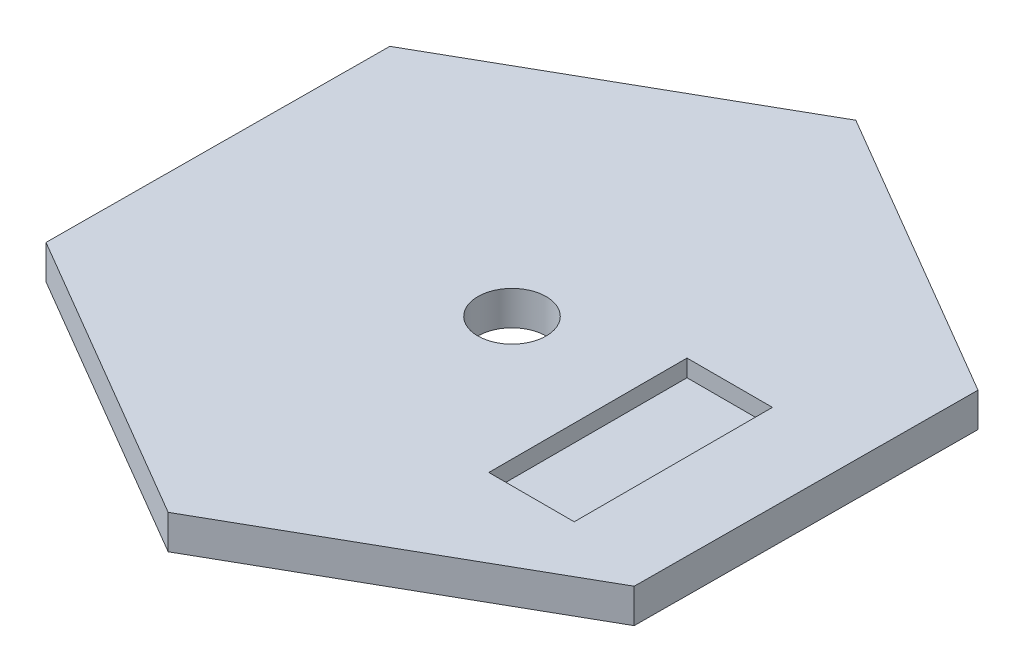
ISO-10303-21;
HEADER;
FILE_DESCRIPTION(('STEP AP214'),'2;1');
FILE_NAME('part.step','',(''),(''),'','','');
FILE_SCHEMA(('AUTOMOTIVE_DESIGN { 1 0 10303 214 1 1 1 1 }'));
ENDSEC;
DATA;
#1=APPLICATION_CONTEXT('core data for automotive mechanical design processes');
#2=APPLICATION_PROTOCOL_DEFINITION('international standard','automotive_design',2000,#1);
#3=PRODUCT_CONTEXT('',#1,'mechanical');
#4=PRODUCT('Part','Part','',(#3));
#5=PRODUCT_RELATED_PRODUCT_CATEGORY('part','',(#4));
#6=PRODUCT_DEFINITION_FORMATION('','',#4);
#7=PRODUCT_DEFINITION_CONTEXT('part definition',#1,'design');
#8=PRODUCT_DEFINITION('design','',#6,#7);
#9=PRODUCT_DEFINITION_SHAPE('','',#8);
#10=(LENGTH_UNIT() NAMED_UNIT(*) SI_UNIT(.MILLI.,.METRE.));
#11=(NAMED_UNIT(*) PLANE_ANGLE_UNIT() SI_UNIT($,.RADIAN.));
#12=(NAMED_UNIT(*) SI_UNIT($,.STERADIAN.) SOLID_ANGLE_UNIT());
#13=UNCERTAINTY_MEASURE_WITH_UNIT(LENGTH_MEASURE(1.E-05),#10,'distance_accuracy_value','');
#14=(GEOMETRIC_REPRESENTATION_CONTEXT(3) GLOBAL_UNCERTAINTY_ASSIGNED_CONTEXT((#13)) GLOBAL_UNIT_ASSIGNED_CONTEXT((#10,
#11,#12)) REPRESENTATION_CONTEXT('',''));
#15=CARTESIAN_POINT('',(0.,0.,0.));
#16=DIRECTION('',(0.,0.,1.));
#17=DIRECTION('',(1.,0.,0.));
#18=AXIS2_PLACEMENT_3D('',#15,#16,#17);
#19=CARTESIAN_POINT('',(0.619148608107583,10.,-99.9980832566359));
#20=DIRECTION('',(0.49462843204979,0.,0.869104547340518));
#21=DIRECTION('',(0.869104547340518,0.,-0.49462843204979));
#22=AXIS2_PLACEMENT_3D('',#19,#20,#21);
#23=PLANE('',#22);
#24=DIRECTION('',(-0.869104547340518,0.,0.49462843204979));
#25=VECTOR('',#24,1.);
#26=CARTESIAN_POINT('',(0.619148608107583,0.,-99.9980832566359));
#27=LINE('',#26,#25);
#28=CARTESIAN_POINT('',(0.619148608107583,0.,-99.9980832566359));
#29=VERTEX_POINT('',#28);
#30=CARTESIAN_POINT('',(-86.2913061259442,0.,-50.5352400516569));
#31=VERTEX_POINT('',#30);
#32=EDGE_CURVE('E148',#29,#31,#27,.T.);
#33=ORIENTED_EDGE('',*,*,#32,.T.);
#34=DIRECTION('',(0.,-1.,0.));
#35=VECTOR('',#34,1.);
#36=CARTESIAN_POINT('',(-86.2913061259442,10.,-50.5352400516569));
#37=LINE('',#36,#35);
#38=CARTESIAN_POINT('',(-86.2913061259442,10.,-50.5352400516569));
#39=VERTEX_POINT('',#38);
#40=EDGE_CURVE('E11',#39,#31,#37,.T.);
#41=ORIENTED_EDGE('',*,*,#40,.F.);
#42=DIRECTION('',(-0.869104547340518,0.,0.49462843204979));
#43=VECTOR('',#42,1.);
#44=CARTESIAN_POINT('',(0.619148608107583,10.,-99.9980832566359));
#45=LINE('',#44,#43);
#46=CARTESIAN_POINT('',(0.619148608107583,10.,-99.9980832566359));
#47=VERTEX_POINT('',#46);
#48=EDGE_CURVE('E166',#47,#39,#45,.T.);
#49=ORIENTED_EDGE('',*,*,#48,.F.);
#50=DIRECTION('',(0.,-1.,0.));
#51=VECTOR('',#50,1.);
#52=CARTESIAN_POINT('',(0.619148608107583,10.,-99.9980832566359));
#53=LINE('',#52,#51);
#54=EDGE_CURVE('E144',#47,#29,#53,.T.);
#55=ORIENTED_EDGE('',*,*,#54,.T.);
#56=EDGE_LOOP('',(#33,#41,#49,#55));
#57=FACE_BOUND('',#56,.T.);
#58=ADVANCED_FACE('F47',(#57),#23,.F.);
#59=CARTESIAN_POINT('',(-86.2913061259442,10.,-50.5352400516569));
#60=DIRECTION('',(0.999980832566359,0.,0.00619148608107578));
#61=DIRECTION('',(0.00619148608107578,0.,-0.999980832566359));
#62=AXIS2_PLACEMENT_3D('',#59,#60,#61);
#63=PLANE('',#62);
#64=DIRECTION('',(-0.00619148608107578,0.,0.999980832566359));
#65=VECTOR('',#64,1.);
#66=CARTESIAN_POINT('',(-86.2913061259442,0.,-50.5352400516569));
#67=LINE('',#66,#65);
#68=CARTESIAN_POINT('',(-86.9104547340518,0.,49.462843204979));
#69=VERTEX_POINT('',#68);
#70=EDGE_CURVE('E152',#31,#69,#67,.T.);
#71=ORIENTED_EDGE('',*,*,#70,.T.);
#72=DIRECTION('',(0.,-1.,0.));
#73=VECTOR('',#72,1.);
#74=CARTESIAN_POINT('',(-86.9104547340518,10.,49.462843204979));
#75=LINE('',#74,#73);
#76=CARTESIAN_POINT('',(-86.9104547340518,10.,49.462843204979));
#77=VERTEX_POINT('',#76);
#78=EDGE_CURVE('E55',#77,#69,#75,.T.);
#79=ORIENTED_EDGE('',*,*,#78,.F.);
#80=DIRECTION('',(-0.00619148608107578,0.,0.999980832566359));
#81=VECTOR('',#80,1.);
#82=CARTESIAN_POINT('',(-86.2913061259442,10.,-50.5352400516569));
#83=LINE('',#82,#81);
#84=EDGE_CURVE('E106',#39,#77,#83,.T.);
#85=ORIENTED_EDGE('',*,*,#84,.F.);
#86=ORIENTED_EDGE('',*,*,#40,.T.);
#87=EDGE_LOOP('',(#71,#79,#85,#86));
#88=FACE_BOUND('',#87,.T.);
#89=ADVANCED_FACE('F281',(#88),#63,.F.);
#90=CARTESIAN_POINT('',(-86.9104547340518,10.,49.462843204979));
#91=DIRECTION('',(0.505352400516569,0.,-0.862913061259442));
#92=DIRECTION('',(-0.862913061259442,0.,-0.505352400516569));
#93=AXIS2_PLACEMENT_3D('',#90,#91,#92);
#94=PLANE('',#93);
#95=DIRECTION('',(0.862913061259442,0.,0.505352400516569));
#96=VECTOR('',#95,1.);
#97=CARTESIAN_POINT('',(-86.9104547340518,0.,49.462843204979));
#98=LINE('',#97,#96);
#99=CARTESIAN_POINT('',(-0.619148608107599,0.,99.9980832566359));
#100=VERTEX_POINT('',#99);
#101=EDGE_CURVE('E156',#69,#100,#98,.T.);
#102=ORIENTED_EDGE('',*,*,#101,.T.);
#103=DIRECTION('',(0.,-1.,0.));
#104=VECTOR('',#103,1.);
#105=CARTESIAN_POINT('',(-0.619148608107599,10.,99.9980832566359));
#106=LINE('',#105,#104);
#107=CARTESIAN_POINT('',(-0.619148608107599,10.,99.9980832566359));
#108=VERTEX_POINT('',#107);
#109=EDGE_CURVE('E137',#108,#100,#106,.T.);
#110=ORIENTED_EDGE('',*,*,#109,.F.);
#111=DIRECTION('',(0.862913061259442,0.,0.505352400516569));
#112=VECTOR('',#111,1.);
#113=CARTESIAN_POINT('',(-86.9104547340518,10.,49.462843204979));
#114=LINE('',#113,#112);
#115=EDGE_CURVE('E123',#77,#108,#114,.T.);
#116=ORIENTED_EDGE('',*,*,#115,.F.);
#117=ORIENTED_EDGE('',*,*,#78,.T.);
#118=EDGE_LOOP('',(#102,#110,#116,#117));
#119=FACE_BOUND('',#118,.T.);
#120=ADVANCED_FACE('F176',(#119),#94,.F.);
#121=CARTESIAN_POINT('',(-0.619148608107599,10.,99.9980832566359));
#122=DIRECTION('',(-0.49462843204979,0.,-0.869104547340518));
#123=DIRECTION('',(-0.869104547340518,0.,0.49462843204979));
#124=AXIS2_PLACEMENT_3D('',#121,#122,#123);
#125=PLANE('',#124);
#126=DIRECTION('',(0.869104547340518,0.,-0.49462843204979));
#127=VECTOR('',#126,1.);
#128=CARTESIAN_POINT('',(-0.619148608107599,0.,99.9980832566359));
#129=LINE('',#128,#127);
#130=CARTESIAN_POINT('',(86.2913061259442,0.,50.5352400516569));
#131=VERTEX_POINT('',#130);
#132=EDGE_CURVE('E133',#100,#131,#129,.T.);
#133=ORIENTED_EDGE('',*,*,#132,.T.);
#134=DIRECTION('',(0.,-1.,0.));
#135=VECTOR('',#134,1.);
#136=CARTESIAN_POINT('',(86.2913061259442,10.,50.5352400516569));
#137=LINE('',#136,#135);
#138=CARTESIAN_POINT('',(86.2913061259442,10.,50.5352400516569));
#139=VERTEX_POINT('',#138);
#140=EDGE_CURVE('E130',#139,#131,#137,.T.);
#141=ORIENTED_EDGE('',*,*,#140,.F.);
#142=DIRECTION('',(0.869104547340518,0.,-0.49462843204979));
#143=VECTOR('',#142,1.);
#144=CARTESIAN_POINT('',(-0.619148608107599,10.,99.9980832566359));
#145=LINE('',#144,#143);
#146=EDGE_CURVE('E116',#108,#139,#145,.T.);
#147=ORIENTED_EDGE('',*,*,#146,.F.);
#148=ORIENTED_EDGE('',*,*,#109,.T.);
#149=EDGE_LOOP('',(#133,#141,#147,#148));
#150=FACE_BOUND('',#149,.T.);
#151=ADVANCED_FACE('F131',(#150),#125,.F.);
#152=CARTESIAN_POINT('',(86.2913061259442,10.,50.5352400516569));
#153=DIRECTION('',(-0.999980832566359,0.,-0.00619148608107592));
#154=DIRECTION('',(-0.00619148608107592,0.,0.999980832566359));
#155=AXIS2_PLACEMENT_3D('',#152,#153,#154);
#156=PLANE('',#155);
#157=DIRECTION('',(0.00619148608107592,0.,-0.999980832566359));
#158=VECTOR('',#157,1.);
#159=CARTESIAN_POINT('',(86.2913061259442,0.,50.5352400516569));
#160=LINE('',#159,#158);
#161=CARTESIAN_POINT('',(86.9104547340518,0.,-49.462843204979));
#162=VERTEX_POINT('',#161);
#163=EDGE_CURVE('E161',#131,#162,#160,.T.);
#164=ORIENTED_EDGE('',*,*,#163,.T.);
#165=DIRECTION('',(0.,-1.,0.));
#166=VECTOR('',#165,1.);
#167=CARTESIAN_POINT('',(86.9104547340518,10.,-49.462843204979));
#168=LINE('',#167,#166);
#169=CARTESIAN_POINT('',(86.9104547340518,10.,-49.462843204979));
#170=VERTEX_POINT('',#169);
#171=EDGE_CURVE('E138',#170,#162,#168,.T.);
#172=ORIENTED_EDGE('',*,*,#171,.F.);
#173=DIRECTION('',(0.00619148608107592,0.,-0.999980832566359));
#174=VECTOR('',#173,1.);
#175=CARTESIAN_POINT('',(86.2913061259442,10.,50.5352400516569));
#176=LINE('',#175,#174);
#177=EDGE_CURVE('E120',#139,#170,#176,.T.);
#178=ORIENTED_EDGE('',*,*,#177,.F.);
#179=ORIENTED_EDGE('',*,*,#140,.T.);
#180=EDGE_LOOP('',(#164,#172,#178,#179));
#181=FACE_BOUND('',#180,.T.);
#182=ADVANCED_FACE('F140',(#181),#156,.F.);
#183=CARTESIAN_POINT('',(86.9104547340518,10.,-49.462843204979));
#184=DIRECTION('',(-0.505352400516569,0.,0.862913061259442));
#185=DIRECTION('',(0.862913061259442,0.,0.505352400516569));
#186=AXIS2_PLACEMENT_3D('',#183,#184,#185);
#187=PLANE('',#186);
#188=DIRECTION('',(-0.862913061259442,0.,-0.505352400516569));
#189=VECTOR('',#188,1.);
#190=CARTESIAN_POINT('',(86.9104547340518,0.,-49.462843204979));
#191=LINE('',#190,#189);
#192=EDGE_CURVE('E98',#162,#29,#191,.T.);
#193=ORIENTED_EDGE('',*,*,#192,.T.);
#194=ORIENTED_EDGE('',*,*,#54,.F.);
#195=DIRECTION('',(-0.862913061259442,0.,-0.505352400516569));
#196=VECTOR('',#195,1.);
#197=CARTESIAN_POINT('',(86.9104547340518,10.,-49.462843204979));
#198=LINE('',#197,#196);
#199=EDGE_CURVE('E71',#170,#47,#198,.T.);
#200=ORIENTED_EDGE('',*,*,#199,.F.);
#201=ORIENTED_EDGE('',*,*,#171,.T.);
#202=EDGE_LOOP('',(#193,#194,#200,#201));
#203=FACE_BOUND('',#202,.T.);
#204=ADVANCED_FACE('F180',(#203),#187,.F.);
#205=CARTESIAN_POINT('',(0.,10.,0.));
#206=DIRECTION('',(0.,1.,0.));
#207=DIRECTION('',(0.,0.,1.));
#208=AXIS2_PLACEMENT_3D('',#205,#206,#207);
#209=PLANE('',#208);
#210=DIRECTION('',(0.,0.,1.));
#211=VECTOR('',#210,1.);
#212=CARTESIAN_POINT('',(36.1932906042658,10.,-15.0209068033826));
#213=LINE('',#212,#211);
#214=CARTESIAN_POINT('',(36.1932906042658,10.,-15.0209068033826));
#215=VERTEX_POINT('',#214);
#216=CARTESIAN_POINT('',(36.1932906042658,10.,42.9790931966174));
#217=VERTEX_POINT('',#216);
#218=EDGE_CURVE('E62',#215,#217,#213,.T.);
#219=ORIENTED_EDGE('',*,*,#218,.F.);
#220=DIRECTION('',(-1.,0.,0.));
#221=VECTOR('',#220,1.);
#222=CARTESIAN_POINT('',(36.1932906042658,10.,-15.0209068033826));
#223=LINE('',#222,#221);
#224=CARTESIAN_POINT('',(61.1932906042658,10.,-15.0209068033826));
#225=VERTEX_POINT('',#224);
#226=EDGE_CURVE('E212',#225,#215,#223,.T.);
#227=ORIENTED_EDGE('',*,*,#226,.F.);
#228=DIRECTION('',(0.,0.,-1.));
#229=VECTOR('',#228,1.);
#230=CARTESIAN_POINT('',(61.1932906042658,10.,-15.0209068033826));
#231=LINE('',#230,#229);
#232=CARTESIAN_POINT('',(61.1932906042658,10.,42.9790931966174));
#233=VERTEX_POINT('',#232);
#234=EDGE_CURVE('E217',#233,#225,#231,.T.);
#235=ORIENTED_EDGE('',*,*,#234,.F.);
#236=DIRECTION('',(1.,0.,0.));
#237=VECTOR('',#236,1.);
#238=CARTESIAN_POINT('',(36.1932906042658,10.,42.9790931966174));
#239=LINE('',#238,#237);
#240=EDGE_CURVE('E221',#217,#233,#239,.T.);
#241=ORIENTED_EDGE('',*,*,#240,.F.);
#242=EDGE_LOOP('',(#219,#227,#235,#241));
#243=FACE_BOUND('',#242,.T.);
#244=CARTESIAN_POINT('',(0.,10.,0.));
#245=DIRECTION('',(0.,1.,0.));
#246=DIRECTION('',(0.,0.,1.));
#247=AXIS2_PLACEMENT_3D('',#244,#245,#246);
#248=CIRCLE('',#247,10.);
#249=CARTESIAN_POINT('',(0.,10.,10.));
#250=VERTEX_POINT('',#249);
#251=EDGE_CURVE('E189',#250,#250,#248,.T.);
#252=ORIENTED_EDGE('',*,*,#251,.F.);
#253=EDGE_LOOP('',(#252));
#254=FACE_BOUND('',#253,.T.);
#255=ORIENTED_EDGE('',*,*,#48,.T.);
#256=ORIENTED_EDGE('',*,*,#84,.T.);
#257=ORIENTED_EDGE('',*,*,#115,.T.);
#258=ORIENTED_EDGE('',*,*,#146,.T.);
#259=ORIENTED_EDGE('',*,*,#177,.T.);
#260=ORIENTED_EDGE('',*,*,#199,.T.);
#261=EDGE_LOOP('',(#255,#256,#257,#258,#259,#260));
#262=FACE_BOUND('',#261,.T.);
#263=ADVANCED_FACE('F118',(#243,#254,#262),#209,.T.);
#264=CARTESIAN_POINT('',(0.,0.,0.));
#265=DIRECTION('',(0.,1.,0.));
#266=DIRECTION('',(0.,0.,1.));
#267=AXIS2_PLACEMENT_3D('',#264,#265,#266);
#268=PLANE('',#267);
#269=CARTESIAN_POINT('',(0.,0.,0.));
#270=DIRECTION('',(0.,1.,0.));
#271=DIRECTION('',(0.,0.,1.));
#272=AXIS2_PLACEMENT_3D('',#269,#270,#271);
#273=CIRCLE('',#272,10.);
#274=CARTESIAN_POINT('',(0.,0.,10.));
#275=VERTEX_POINT('',#274);
#276=EDGE_CURVE('E153',#275,#275,#273,.T.);
#277=ORIENTED_EDGE('',*,*,#276,.T.);
#278=EDGE_LOOP('',(#277));
#279=FACE_BOUND('',#278,.T.);
#280=ORIENTED_EDGE('',*,*,#32,.F.);
#281=ORIENTED_EDGE('',*,*,#192,.F.);
#282=ORIENTED_EDGE('',*,*,#163,.F.);
#283=ORIENTED_EDGE('',*,*,#132,.F.);
#284=ORIENTED_EDGE('',*,*,#101,.F.);
#285=ORIENTED_EDGE('',*,*,#70,.F.);
#286=EDGE_LOOP('',(#280,#281,#282,#283,#284,#285));
#287=FACE_BOUND('',#286,.T.);
#288=ADVANCED_FACE('F179',(#279,#287),#268,.F.);
#289=CARTESIAN_POINT('',(0.,0.,0.));
#290=DIRECTION('',(0.,1.,0.));
#291=DIRECTION('',(0.,0.,1.));
#292=AXIS2_PLACEMENT_3D('',#289,#290,#291);
#293=CYLINDRICAL_SURFACE('',#292,10.);
#294=ORIENTED_EDGE('',*,*,#276,.F.);
#295=EDGE_LOOP('',(#294));
#296=FACE_BOUND('',#295,.T.);
#297=ORIENTED_EDGE('',*,*,#251,.T.);
#298=EDGE_LOOP('',(#297));
#299=FACE_BOUND('',#298,.T.);
#300=ADVANCED_FACE('F296',(#296,#299),#293,.F.);
#301=CARTESIAN_POINT('',(36.1932906042658,5.,-15.0209068033826));
#302=DIRECTION('',(-1.,0.,0.));
#303=DIRECTION('',(0.,0.,1.));
#304=AXIS2_PLACEMENT_3D('',#301,#302,#303);
#305=PLANE('',#304);
#306=ORIENTED_EDGE('',*,*,#218,.T.);
#307=DIRECTION('',(0.,1.,0.));
#308=VECTOR('',#307,1.);
#309=CARTESIAN_POINT('',(36.1932906042658,5.,42.9790931966174));
#310=LINE('',#309,#308);
#311=CARTESIAN_POINT('',(36.1932906042658,5.,42.9790931966174));
#312=VERTEX_POINT('',#311);
#313=EDGE_CURVE('E198',#312,#217,#310,.T.);
#314=ORIENTED_EDGE('',*,*,#313,.F.);
#315=DIRECTION('',(0.,0.,1.));
#316=VECTOR('',#315,1.);
#317=CARTESIAN_POINT('',(36.1932906042658,5.,-15.0209068033826));
#318=LINE('',#317,#316);
#319=CARTESIAN_POINT('',(36.1932906042658,5.,-15.0209068033826));
#320=VERTEX_POINT('',#319);
#321=EDGE_CURVE('E216',#320,#312,#318,.T.);
#322=ORIENTED_EDGE('',*,*,#321,.F.);
#323=DIRECTION('',(0.,1.,0.));
#324=VECTOR('',#323,1.);
#325=CARTESIAN_POINT('',(36.1932906042658,5.,-15.0209068033826));
#326=LINE('',#325,#324);
#327=EDGE_CURVE('E194',#320,#215,#326,.T.);
#328=ORIENTED_EDGE('',*,*,#327,.T.);
#329=EDGE_LOOP('',(#306,#314,#322,#328));
#330=FACE_BOUND('',#329,.T.);
#331=ADVANCED_FACE('F248',(#330),#305,.F.);
#332=CARTESIAN_POINT('',(36.1932906042658,5.,-15.0209068033826));
#333=DIRECTION('',(0.,0.,-1.));
#334=DIRECTION('',(-1.,0.,0.));
#335=AXIS2_PLACEMENT_3D('',#332,#333,#334);
#336=PLANE('',#335);
#337=ORIENTED_EDGE('',*,*,#226,.T.);
#338=ORIENTED_EDGE('',*,*,#327,.F.);
#339=DIRECTION('',(-1.,0.,0.));
#340=VECTOR('',#339,1.);
#341=CARTESIAN_POINT('',(36.1932906042658,5.,-15.0209068033826));
#342=LINE('',#341,#340);
#343=CARTESIAN_POINT('',(61.1932906042658,5.,-15.0209068033826));
#344=VERTEX_POINT('',#343);
#345=EDGE_CURVE('E202',#344,#320,#342,.T.);
#346=ORIENTED_EDGE('',*,*,#345,.F.);
#347=DIRECTION('',(0.,1.,0.));
#348=VECTOR('',#347,1.);
#349=CARTESIAN_POINT('',(61.1932906042658,5.,-15.0209068033826));
#350=LINE('',#349,#348);
#351=EDGE_CURVE('E206',#344,#225,#350,.T.);
#352=ORIENTED_EDGE('',*,*,#351,.T.);
#353=EDGE_LOOP('',(#337,#338,#346,#352));
#354=FACE_BOUND('',#353,.T.);
#355=ADVANCED_FACE('F259',(#354),#336,.F.);
#356=CARTESIAN_POINT('',(61.1932906042658,5.,-15.0209068033826));
#357=DIRECTION('',(1.,0.,0.));
#358=DIRECTION('',(0.,0.,-1.));
#359=AXIS2_PLACEMENT_3D('',#356,#357,#358);
#360=PLANE('',#359);
#361=ORIENTED_EDGE('',*,*,#234,.T.);
#362=ORIENTED_EDGE('',*,*,#351,.F.);
#363=DIRECTION('',(0.,0.,-1.));
#364=VECTOR('',#363,1.);
#365=CARTESIAN_POINT('',(61.1932906042658,5.,-15.0209068033826));
#366=LINE('',#365,#364);
#367=CARTESIAN_POINT('',(61.1932906042658,5.,42.9790931966174));
#368=VERTEX_POINT('',#367);
#369=EDGE_CURVE('E230',#368,#344,#366,.T.);
#370=ORIENTED_EDGE('',*,*,#369,.F.);
#371=DIRECTION('',(0.,1.,0.));
#372=VECTOR('',#371,1.);
#373=CARTESIAN_POINT('',(61.1932906042658,5.,42.9790931966174));
#374=LINE('',#373,#372);
#375=EDGE_CURVE('E201',#368,#233,#374,.T.);
#376=ORIENTED_EDGE('',*,*,#375,.T.);
#377=EDGE_LOOP('',(#361,#362,#370,#376));
#378=FACE_BOUND('',#377,.T.);
#379=ADVANCED_FACE('F264',(#378),#360,.F.);
#380=CARTESIAN_POINT('',(36.1932906042658,5.,42.9790931966174));
#381=DIRECTION('',(0.,0.,1.));
#382=DIRECTION('',(1.,0.,0.));
#383=AXIS2_PLACEMENT_3D('',#380,#381,#382);
#384=PLANE('',#383);
#385=ORIENTED_EDGE('',*,*,#240,.T.);
#386=ORIENTED_EDGE('',*,*,#375,.F.);
#387=DIRECTION('',(1.,0.,0.));
#388=VECTOR('',#387,1.);
#389=CARTESIAN_POINT('',(36.1932906042658,5.,42.9790931966174));
#390=LINE('',#389,#388);
#391=EDGE_CURVE('E234',#312,#368,#390,.T.);
#392=ORIENTED_EDGE('',*,*,#391,.F.);
#393=ORIENTED_EDGE('',*,*,#313,.T.);
#394=EDGE_LOOP('',(#385,#386,#392,#393));
#395=FACE_BOUND('',#394,.T.);
#396=ADVANCED_FACE('F270',(#395),#384,.F.);
#397=CARTESIAN_POINT('',(0.,5.,0.));
#398=DIRECTION('',(0.,1.,0.));
#399=DIRECTION('',(0.,0.,1.));
#400=AXIS2_PLACEMENT_3D('',#397,#398,#399);
#401=PLANE('',#400);
#402=ORIENTED_EDGE('',*,*,#321,.T.);
#403=ORIENTED_EDGE('',*,*,#391,.T.);
#404=ORIENTED_EDGE('',*,*,#369,.T.);
#405=ORIENTED_EDGE('',*,*,#345,.T.);
#406=EDGE_LOOP('',(#402,#403,#404,#405));
#407=FACE_BOUND('',#406,.T.);
#408=ADVANCED_FACE('F243',(#407),#401,.T.);
#409=CLOSED_SHELL('',(#58,#89,#120,#151,#182,#204,#263,#288,#300,#331,#355,#379,#396,#408));
#410=MANIFOLD_SOLID_BREP('B2',#409);
#411=ADVANCED_BREP_SHAPE_REPRESENTATION('',(#18,#410),#14);
#412=SHAPE_DEFINITION_REPRESENTATION(#9,#411);
ENDSEC;
END-ISO-10303-21;
